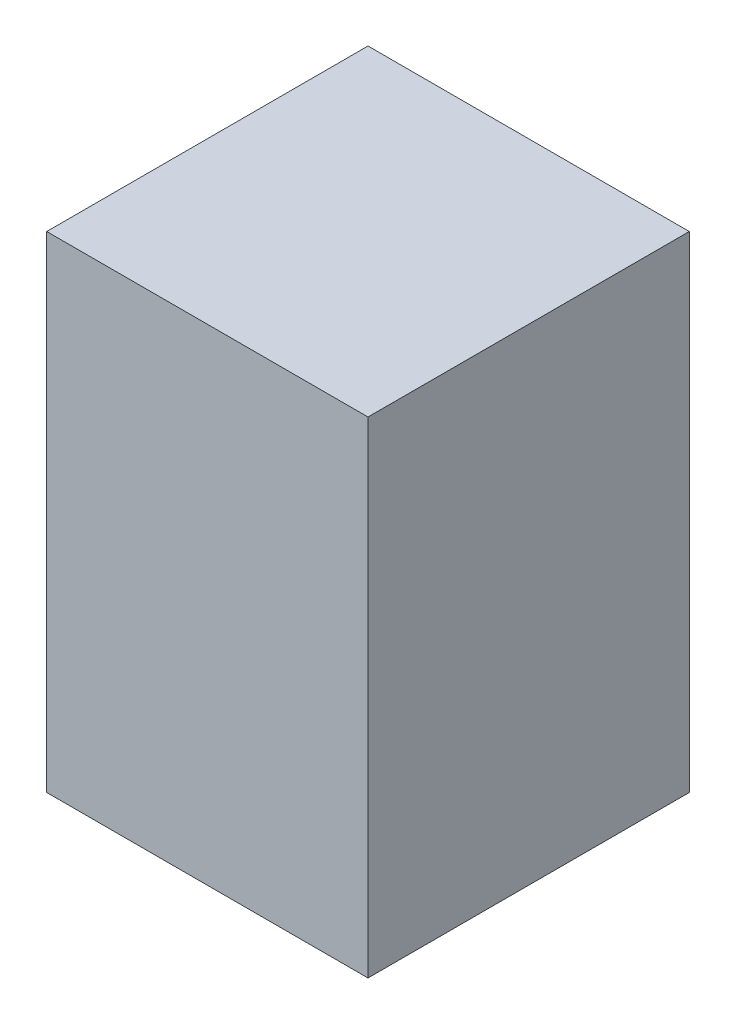
ISO-10303-21;
HEADER;
FILE_DESCRIPTION(('STEP AP214'),'2;1');
FILE_NAME('part.step','',(''),(''),'','','');
FILE_SCHEMA(('AUTOMOTIVE_DESIGN { 1 0 10303 214 1 1 1 1 }'));
ENDSEC;
DATA;
#1=APPLICATION_CONTEXT('core data for automotive mechanical design processes');
#2=APPLICATION_PROTOCOL_DEFINITION('international standard','automotive_design',2000,#1);
#3=PRODUCT_CONTEXT('',#1,'mechanical');
#4=PRODUCT('Part','Part','',(#3));
#5=PRODUCT_RELATED_PRODUCT_CATEGORY('part','',(#4));
#6=PRODUCT_DEFINITION_FORMATION('','',#4);
#7=PRODUCT_DEFINITION_CONTEXT('part definition',#1,'design');
#8=PRODUCT_DEFINITION('design','',#6,#7);
#9=PRODUCT_DEFINITION_SHAPE('','',#8);
#10=(LENGTH_UNIT() NAMED_UNIT(*) SI_UNIT(.MILLI.,.METRE.));
#11=(NAMED_UNIT(*) PLANE_ANGLE_UNIT() SI_UNIT($,.RADIAN.));
#12=(NAMED_UNIT(*) SI_UNIT($,.STERADIAN.) SOLID_ANGLE_UNIT());
#13=UNCERTAINTY_MEASURE_WITH_UNIT(LENGTH_MEASURE(1.E-05),#10,'distance_accuracy_value','');
#14=(GEOMETRIC_REPRESENTATION_CONTEXT(3) GLOBAL_UNCERTAINTY_ASSIGNED_CONTEXT((#13)) GLOBAL_UNIT_ASSIGNED_CONTEXT((#10,
#11,#12)) REPRESENTATION_CONTEXT('',''));
#15=CARTESIAN_POINT('',(0.,0.,0.));
#16=DIRECTION('',(0.,0.,1.));
#17=DIRECTION('',(1.,0.,0.));
#18=AXIS2_PLACEMENT_3D('',#15,#16,#17);
#19=CARTESIAN_POINT('',(41.,124.,-41.));
#20=DIRECTION('',(-1.,0.,0.));
#21=DIRECTION('',(0.,0.,1.));
#22=AXIS2_PLACEMENT_3D('',#19,#20,#21);
#23=PLANE('',#22);
#24=DIRECTION('',(0.,0.,-1.));
#25=VECTOR('',#24,1.);
#26=CARTESIAN_POINT('',(41.,0.,-41.));
#27=LINE('',#26,#25);
#28=CARTESIAN_POINT('',(41.,0.,41.));
#29=VERTEX_POINT('',#28);
#30=CARTESIAN_POINT('',(41.,0.,-41.));
#31=VERTEX_POINT('',#30);
#32=EDGE_CURVE('E111',#29,#31,#27,.T.);
#33=ORIENTED_EDGE('',*,*,#32,.T.);
#34=DIRECTION('',(0.,-1.,0.));
#35=VECTOR('',#34,1.);
#36=CARTESIAN_POINT('',(41.,124.,-41.));
#37=LINE('',#36,#35);
#38=CARTESIAN_POINT('',(41.,124.,-41.));
#39=VERTEX_POINT('',#38);
#40=EDGE_CURVE('E11',#39,#31,#37,.T.);
#41=ORIENTED_EDGE('',*,*,#40,.F.);
#42=DIRECTION('',(0.,0.,-1.));
#43=VECTOR('',#42,1.);
#44=CARTESIAN_POINT('',(41.,124.,-41.));
#45=LINE('',#44,#43);
#46=CARTESIAN_POINT('',(41.,124.,41.));
#47=VERTEX_POINT('',#46);
#48=EDGE_CURVE('E95',#47,#39,#45,.T.);
#49=ORIENTED_EDGE('',*,*,#48,.F.);
#50=DIRECTION('',(0.,-1.,0.));
#51=VECTOR('',#50,1.);
#52=CARTESIAN_POINT('',(41.,124.,41.));
#53=LINE('',#52,#51);
#54=EDGE_CURVE('E107',#47,#29,#53,.T.);
#55=ORIENTED_EDGE('',*,*,#54,.T.);
#56=EDGE_LOOP('',(#33,#41,#49,#55));
#57=FACE_BOUND('',#56,.T.);
#58=ADVANCED_FACE('F43',(#57),#23,.F.);
#59=CARTESIAN_POINT('',(-41.,124.,-41.));
#60=DIRECTION('',(0.,0.,1.));
#61=DIRECTION('',(1.,0.,0.));
#62=AXIS2_PLACEMENT_3D('',#59,#60,#61);
#63=PLANE('',#62);
#64=DIRECTION('',(-1.,0.,0.));
#65=VECTOR('',#64,1.);
#66=CARTESIAN_POINT('',(-41.,0.,-41.));
#67=LINE('',#66,#65);
#68=CARTESIAN_POINT('',(-41.,0.,-41.));
#69=VERTEX_POINT('',#68);
#70=EDGE_CURVE('E100',#31,#69,#67,.T.);
#71=ORIENTED_EDGE('',*,*,#70,.T.);
#72=DIRECTION('',(0.,-1.,0.));
#73=VECTOR('',#72,1.);
#74=CARTESIAN_POINT('',(-41.,124.,-41.));
#75=LINE('',#74,#73);
#76=CARTESIAN_POINT('',(-41.,124.,-41.));
#77=VERTEX_POINT('',#76);
#78=EDGE_CURVE('E52',#77,#69,#75,.T.);
#79=ORIENTED_EDGE('',*,*,#78,.F.);
#80=DIRECTION('',(-1.,0.,0.));
#81=VECTOR('',#80,1.);
#82=CARTESIAN_POINT('',(-41.,124.,-41.));
#83=LINE('',#82,#81);
#84=EDGE_CURVE('E90',#39,#77,#83,.T.);
#85=ORIENTED_EDGE('',*,*,#84,.F.);
#86=ORIENTED_EDGE('',*,*,#40,.T.);
#87=EDGE_LOOP('',(#71,#79,#85,#86));
#88=FACE_BOUND('',#87,.T.);
#89=ADVANCED_FACE('F99',(#88),#63,.F.);
#90=CARTESIAN_POINT('',(-41.,124.,-41.));
#91=DIRECTION('',(1.,0.,0.));
#92=DIRECTION('',(0.,0.,-1.));
#93=AXIS2_PLACEMENT_3D('',#90,#91,#92);
#94=PLANE('',#93);
#95=DIRECTION('',(0.,0.,1.));
#96=VECTOR('',#95,1.);
#97=CARTESIAN_POINT('',(-41.,0.,-41.));
#98=LINE('',#97,#96);
#99=CARTESIAN_POINT('',(-41.,0.,41.));
#100=VERTEX_POINT('',#99);
#101=EDGE_CURVE('E77',#69,#100,#98,.T.);
#102=ORIENTED_EDGE('',*,*,#101,.T.);
#103=DIRECTION('',(0.,-1.,0.));
#104=VECTOR('',#103,1.);
#105=CARTESIAN_POINT('',(-41.,124.,41.));
#106=LINE('',#105,#104);
#107=CARTESIAN_POINT('',(-41.,124.,41.));
#108=VERTEX_POINT('',#107);
#109=EDGE_CURVE('E102',#108,#100,#106,.T.);
#110=ORIENTED_EDGE('',*,*,#109,.F.);
#111=DIRECTION('',(0.,0.,1.));
#112=VECTOR('',#111,1.);
#113=CARTESIAN_POINT('',(-41.,124.,-41.));
#114=LINE('',#113,#112);
#115=EDGE_CURVE('E93',#77,#108,#114,.T.);
#116=ORIENTED_EDGE('',*,*,#115,.F.);
#117=ORIENTED_EDGE('',*,*,#78,.T.);
#118=EDGE_LOOP('',(#102,#110,#116,#117));
#119=FACE_BOUND('',#118,.T.);
#120=ADVANCED_FACE('F103',(#119),#94,.F.);
#121=CARTESIAN_POINT('',(-41.,124.,41.));
#122=DIRECTION('',(0.,0.,-1.));
#123=DIRECTION('',(-1.,0.,0.));
#124=AXIS2_PLACEMENT_3D('',#121,#122,#123);
#125=PLANE('',#124);
#126=DIRECTION('',(1.,0.,0.));
#127=VECTOR('',#126,1.);
#128=CARTESIAN_POINT('',(-41.,0.,41.));
#129=LINE('',#128,#127);
#130=EDGE_CURVE('E83',#100,#29,#129,.T.);
#131=ORIENTED_EDGE('',*,*,#130,.T.);
#132=ORIENTED_EDGE('',*,*,#54,.F.);
#133=DIRECTION('',(1.,0.,0.));
#134=VECTOR('',#133,1.);
#135=CARTESIAN_POINT('',(-41.,124.,41.));
#136=LINE('',#135,#134);
#137=EDGE_CURVE('E60',#108,#47,#136,.T.);
#138=ORIENTED_EDGE('',*,*,#137,.F.);
#139=ORIENTED_EDGE('',*,*,#109,.T.);
#140=EDGE_LOOP('',(#131,#132,#138,#139));
#141=FACE_BOUND('',#140,.T.);
#142=ADVANCED_FACE('F124',(#141),#125,.F.);
#143=CARTESIAN_POINT('',(0.,124.,0.));
#144=DIRECTION('',(0.,1.,0.));
#145=DIRECTION('',(0.,0.,1.));
#146=AXIS2_PLACEMENT_3D('',#143,#144,#145);
#147=PLANE('',#146);
#148=ORIENTED_EDGE('',*,*,#48,.T.);
#149=ORIENTED_EDGE('',*,*,#84,.T.);
#150=ORIENTED_EDGE('',*,*,#115,.T.);
#151=ORIENTED_EDGE('',*,*,#137,.T.);
#152=EDGE_LOOP('',(#148,#149,#150,#151));
#153=FACE_BOUND('',#152,.T.);
#154=ADVANCED_FACE('F91',(#153),#147,.T.);
#155=CARTESIAN_POINT('',(0.,0.,0.));
#156=DIRECTION('',(0.,1.,0.));
#157=DIRECTION('',(0.,0.,1.));
#158=AXIS2_PLACEMENT_3D('',#155,#156,#157);
#159=PLANE('',#158);
#160=ORIENTED_EDGE('',*,*,#32,.F.);
#161=ORIENTED_EDGE('',*,*,#130,.F.);
#162=ORIENTED_EDGE('',*,*,#101,.F.);
#163=ORIENTED_EDGE('',*,*,#70,.F.);
#164=EDGE_LOOP('',(#160,#161,#162,#163));
#165=FACE_BOUND('',#164,.T.);
#166=ADVANCED_FACE('F127',(#165),#159,.F.);
#167=CLOSED_SHELL('',(#58,#89,#120,#142,#154,#166));
#168=MANIFOLD_SOLID_BREP('B2',#167);
#169=ADVANCED_BREP_SHAPE_REPRESENTATION('',(#18,#168),#14);
#170=SHAPE_DEFINITION_REPRESENTATION(#9,#169);
ENDSEC;
END-ISO-10303-21;
